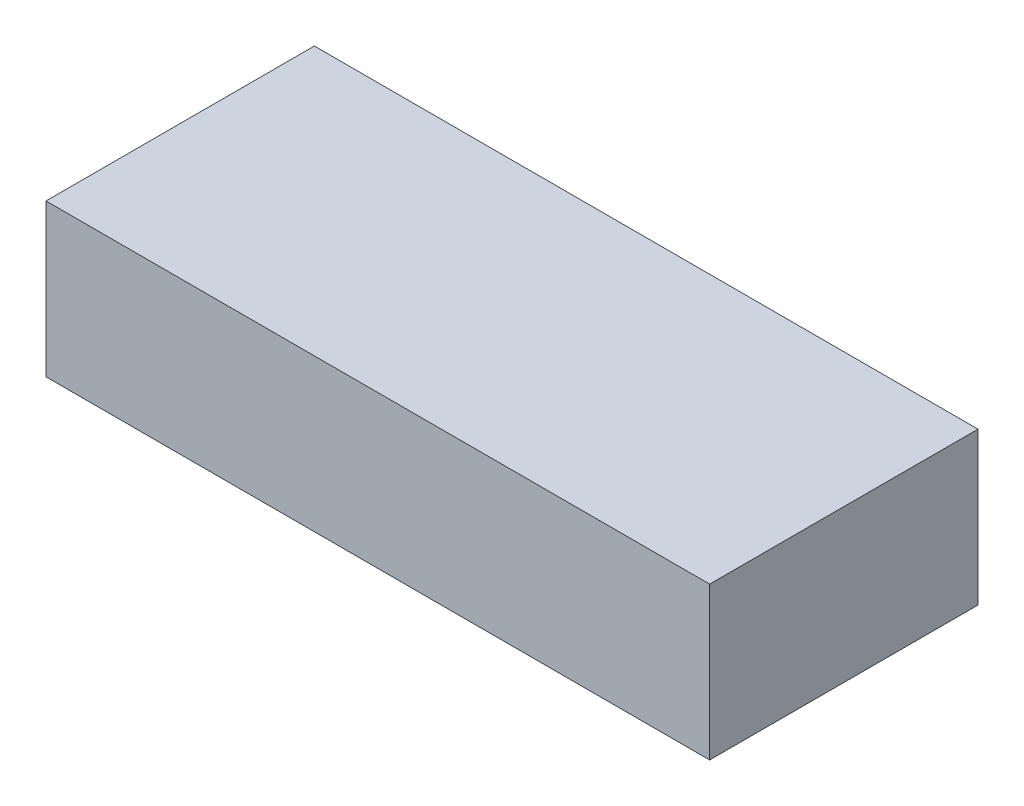
ISO-10303-21;
HEADER;
FILE_DESCRIPTION(('STEP AP214'),'2;1');
FILE_NAME('part.step','',(''),(''),'','','');
FILE_SCHEMA(('AUTOMOTIVE_DESIGN { 1 0 10303 214 1 1 1 1 }'));
ENDSEC;
DATA;
#1=APPLICATION_CONTEXT('core data for automotive mechanical design processes');
#2=APPLICATION_PROTOCOL_DEFINITION('international standard','automotive_design',2000,#1);
#3=PRODUCT_CONTEXT('',#1,'mechanical');
#4=PRODUCT('Part','Part','',(#3));
#5=PRODUCT_RELATED_PRODUCT_CATEGORY('part','',(#4));
#6=PRODUCT_DEFINITION_FORMATION('','',#4);
#7=PRODUCT_DEFINITION_CONTEXT('part definition',#1,'design');
#8=PRODUCT_DEFINITION('design','',#6,#7);
#9=PRODUCT_DEFINITION_SHAPE('','',#8);
#10=(LENGTH_UNIT() NAMED_UNIT(*) SI_UNIT(.MILLI.,.METRE.));
#11=(NAMED_UNIT(*) PLANE_ANGLE_UNIT() SI_UNIT($,.RADIAN.));
#12=(NAMED_UNIT(*) SI_UNIT($,.STERADIAN.) SOLID_ANGLE_UNIT());
#13=UNCERTAINTY_MEASURE_WITH_UNIT(LENGTH_MEASURE(1.E-05),#10,'distance_accuracy_value','');
#14=(GEOMETRIC_REPRESENTATION_CONTEXT(3) GLOBAL_UNCERTAINTY_ASSIGNED_CONTEXT((#13)) GLOBAL_UNIT_ASSIGNED_CONTEXT((#10,
#11,#12)) REPRESENTATION_CONTEXT('',''));
#15=CARTESIAN_POINT('',(0.,0.,0.));
#16=DIRECTION('',(0.,0.,1.));
#17=DIRECTION('',(1.,0.,0.));
#18=AXIS2_PLACEMENT_3D('',#15,#16,#17);
#19=CARTESIAN_POINT('',(457.5,-210.,0.));
#20=DIRECTION('',(1.,0.,0.));
#21=DIRECTION('',(0.,0.,-1.));
#22=AXIS2_PLACEMENT_3D('',#19,#20,#21);
#23=PLANE('',#22);
#24=DIRECTION('',(0.,0.,-1.));
#25=VECTOR('',#24,1.);
#26=CARTESIAN_POINT('',(457.5,0.,0.));
#27=LINE('',#26,#25);
#28=CARTESIAN_POINT('',(457.5,0.,0.));
#29=VERTEX_POINT('',#28);
#30=CARTESIAN_POINT('',(457.5,0.,-370.));
#31=VERTEX_POINT('',#30);
#32=EDGE_CURVE('E96',#29,#31,#27,.T.);
#33=ORIENTED_EDGE('',*,*,#32,.F.);
#34=DIRECTION('',(0.,1.,0.));
#35=VECTOR('',#34,1.);
#36=CARTESIAN_POINT('',(457.5,-210.,0.));
#37=LINE('',#36,#35);
#38=CARTESIAN_POINT('',(457.5,-210.,0.));
#39=VERTEX_POINT('',#38);
#40=EDGE_CURVE('E11',#39,#29,#37,.T.);
#41=ORIENTED_EDGE('',*,*,#40,.F.);
#42=DIRECTION('',(0.,0.,-1.));
#43=VECTOR('',#42,1.);
#44=CARTESIAN_POINT('',(457.5,-210.,0.));
#45=LINE('',#44,#43);
#46=CARTESIAN_POINT('',(457.5,-210.,-370.));
#47=VERTEX_POINT('',#46);
#48=EDGE_CURVE('E90',#39,#47,#45,.T.);
#49=ORIENTED_EDGE('',*,*,#48,.T.);
#50=DIRECTION('',(0.,1.,0.));
#51=VECTOR('',#50,1.);
#52=CARTESIAN_POINT('',(457.5,-210.,-370.));
#53=LINE('',#52,#51);
#54=EDGE_CURVE('E35',#47,#31,#53,.T.);
#55=ORIENTED_EDGE('',*,*,#54,.T.);
#56=EDGE_LOOP('',(#33,#41,#49,#55));
#57=FACE_BOUND('',#56,.T.);
#58=ADVANCED_FACE('F32',(#57),#23,.T.);
#59=CARTESIAN_POINT('',(457.5,-210.,0.));
#60=DIRECTION('',(0.,0.,1.));
#61=DIRECTION('',(1.,0.,0.));
#62=AXIS2_PLACEMENT_3D('',#59,#60,#61);
#63=PLANE('',#62);
#64=DIRECTION('',(1.,0.,0.));
#65=VECTOR('',#64,1.);
#66=CARTESIAN_POINT('',(457.5,0.,0.));
#67=LINE('',#66,#65);
#68=CARTESIAN_POINT('',(-457.5,0.,0.));
#69=VERTEX_POINT('',#68);
#70=EDGE_CURVE('E92',#69,#29,#67,.T.);
#71=ORIENTED_EDGE('',*,*,#70,.F.);
#72=DIRECTION('',(0.,1.,0.));
#73=VECTOR('',#72,1.);
#74=CARTESIAN_POINT('',(-457.5,-210.,0.));
#75=LINE('',#74,#73);
#76=CARTESIAN_POINT('',(-457.5,-210.,0.));
#77=VERTEX_POINT('',#76);
#78=EDGE_CURVE('E41',#77,#69,#75,.T.);
#79=ORIENTED_EDGE('',*,*,#78,.F.);
#80=DIRECTION('',(1.,0.,0.));
#81=VECTOR('',#80,1.);
#82=CARTESIAN_POINT('',(457.5,-210.,0.));
#83=LINE('',#82,#81);
#84=EDGE_CURVE('E87',#77,#39,#83,.T.);
#85=ORIENTED_EDGE('',*,*,#84,.T.);
#86=ORIENTED_EDGE('',*,*,#40,.T.);
#87=EDGE_LOOP('',(#71,#79,#85,#86));
#88=FACE_BOUND('',#87,.T.);
#89=ADVANCED_FACE('F106',(#88),#63,.T.);
#90=CARTESIAN_POINT('',(-457.5,-210.,0.));
#91=DIRECTION('',(-1.,0.,0.));
#92=DIRECTION('',(0.,0.,1.));
#93=AXIS2_PLACEMENT_3D('',#90,#91,#92);
#94=PLANE('',#93);
#95=DIRECTION('',(0.,0.,1.));
#96=VECTOR('',#95,1.);
#97=CARTESIAN_POINT('',(-457.5,0.,0.));
#98=LINE('',#97,#96);
#99=CARTESIAN_POINT('',(-457.5,0.,-370.));
#100=VERTEX_POINT('',#99);
#101=EDGE_CURVE('E82',#100,#69,#98,.T.);
#102=ORIENTED_EDGE('',*,*,#101,.F.);
#103=DIRECTION('',(0.,1.,0.));
#104=VECTOR('',#103,1.);
#105=CARTESIAN_POINT('',(-457.5,-210.,-370.));
#106=LINE('',#105,#104);
#107=CARTESIAN_POINT('',(-457.5,-210.,-370.));
#108=VERTEX_POINT('',#107);
#109=EDGE_CURVE('E77',#108,#100,#106,.T.);
#110=ORIENTED_EDGE('',*,*,#109,.F.);
#111=DIRECTION('',(0.,0.,1.));
#112=VECTOR('',#111,1.);
#113=CARTESIAN_POINT('',(-457.5,-210.,0.));
#114=LINE('',#113,#112);
#115=EDGE_CURVE('E80',#108,#77,#114,.T.);
#116=ORIENTED_EDGE('',*,*,#115,.T.);
#117=ORIENTED_EDGE('',*,*,#78,.T.);
#118=EDGE_LOOP('',(#102,#110,#116,#117));
#119=FACE_BOUND('',#118,.T.);
#120=ADVANCED_FACE('F79',(#119),#94,.T.);
#121=CARTESIAN_POINT('',(457.5,-210.,-370.));
#122=DIRECTION('',(0.,0.,-1.));
#123=DIRECTION('',(-1.,0.,0.));
#124=AXIS2_PLACEMENT_3D('',#121,#122,#123);
#125=PLANE('',#124);
#126=DIRECTION('',(-1.,0.,0.));
#127=VECTOR('',#126,1.);
#128=CARTESIAN_POINT('',(457.5,0.,-370.));
#129=LINE('',#128,#127);
#130=EDGE_CURVE('E99',#31,#100,#129,.T.);
#131=ORIENTED_EDGE('',*,*,#130,.F.);
#132=ORIENTED_EDGE('',*,*,#54,.F.);
#133=DIRECTION('',(-1.,0.,0.));
#134=VECTOR('',#133,1.);
#135=CARTESIAN_POINT('',(457.5,-210.,-370.));
#136=LINE('',#135,#134);
#137=EDGE_CURVE('E86',#47,#108,#136,.T.);
#138=ORIENTED_EDGE('',*,*,#137,.T.);
#139=ORIENTED_EDGE('',*,*,#109,.T.);
#140=EDGE_LOOP('',(#131,#132,#138,#139));
#141=FACE_BOUND('',#140,.T.);
#142=ADVANCED_FACE('F89',(#141),#125,.T.);
#143=CARTESIAN_POINT('',(0.,-210.,0.));
#144=DIRECTION('',(0.,1.,0.));
#145=DIRECTION('',(0.,0.,1.));
#146=AXIS2_PLACEMENT_3D('',#143,#144,#145);
#147=PLANE('',#146);
#148=ORIENTED_EDGE('',*,*,#48,.F.);
#149=ORIENTED_EDGE('',*,*,#84,.F.);
#150=ORIENTED_EDGE('',*,*,#115,.F.);
#151=ORIENTED_EDGE('',*,*,#137,.F.);
#152=EDGE_LOOP('',(#148,#149,#150,#151));
#153=FACE_BOUND('',#152,.T.);
#154=ADVANCED_FACE('F85',(#153),#147,.F.);
#155=CARTESIAN_POINT('',(0.,0.,0.));
#156=DIRECTION('',(0.,1.,0.));
#157=DIRECTION('',(0.,0.,1.));
#158=AXIS2_PLACEMENT_3D('',#155,#156,#157);
#159=PLANE('',#158);
#160=ORIENTED_EDGE('',*,*,#32,.T.);
#161=ORIENTED_EDGE('',*,*,#130,.T.);
#162=ORIENTED_EDGE('',*,*,#101,.T.);
#163=ORIENTED_EDGE('',*,*,#70,.T.);
#164=EDGE_LOOP('',(#160,#161,#162,#163));
#165=FACE_BOUND('',#164,.T.);
#166=ADVANCED_FACE('F105',(#165),#159,.T.);
#167=CLOSED_SHELL('',(#58,#89,#120,#142,#154,#166));
#168=MANIFOLD_SOLID_BREP('B2',#167);
#169=ADVANCED_BREP_SHAPE_REPRESENTATION('',(#18,#168),#14);
#170=SHAPE_DEFINITION_REPRESENTATION(#9,#169);
ENDSEC;
END-ISO-10303-21;
